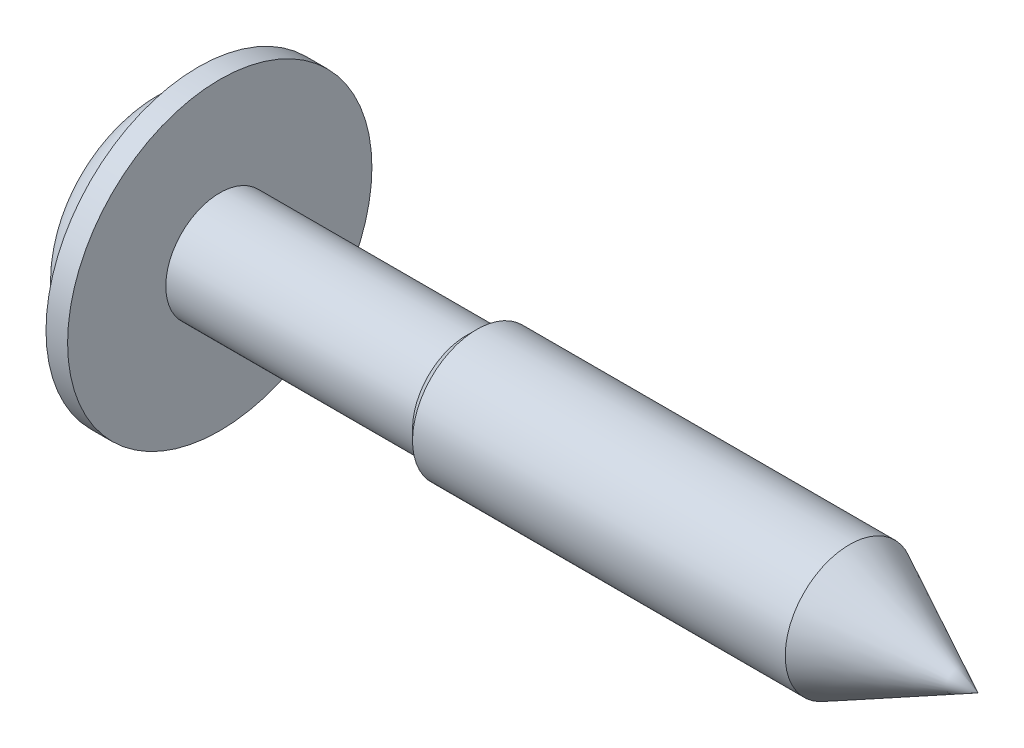
ISO-10303-21;
HEADER;
FILE_DESCRIPTION(('STEP AP214'),'2;1');
FILE_NAME('part.step','',(''),(''),'','','');
FILE_SCHEMA(('AUTOMOTIVE_DESIGN { 1 0 10303 214 1 1 1 1 }'));
ENDSEC;
DATA;
#1=APPLICATION_CONTEXT('core data for automotive mechanical design processes');
#2=APPLICATION_PROTOCOL_DEFINITION('international standard','automotive_design',2000,#1);
#3=PRODUCT_CONTEXT('',#1,'mechanical');
#4=PRODUCT('Part','Part','',(#3));
#5=PRODUCT_RELATED_PRODUCT_CATEGORY('part','',(#4));
#6=PRODUCT_DEFINITION_FORMATION('','',#4);
#7=PRODUCT_DEFINITION_CONTEXT('part definition',#1,'design');
#8=PRODUCT_DEFINITION('design','',#6,#7);
#9=PRODUCT_DEFINITION_SHAPE('','',#8);
#10=(LENGTH_UNIT() NAMED_UNIT(*) SI_UNIT(.MILLI.,.METRE.));
#11=(NAMED_UNIT(*) PLANE_ANGLE_UNIT() SI_UNIT($,.RADIAN.));
#12=(NAMED_UNIT(*) SI_UNIT($,.STERADIAN.) SOLID_ANGLE_UNIT());
#13=UNCERTAINTY_MEASURE_WITH_UNIT(LENGTH_MEASURE(1.E-05),#10,'distance_accuracy_value','');
#14=(GEOMETRIC_REPRESENTATION_CONTEXT(3) GLOBAL_UNCERTAINTY_ASSIGNED_CONTEXT((#13)) GLOBAL_UNIT_ASSIGNED_CONTEXT((#10,
#11,#12)) REPRESENTATION_CONTEXT('',''));
#15=CARTESIAN_POINT('',(0.,0.,0.));
#16=DIRECTION('',(0.,0.,1.));
#17=DIRECTION('',(1.,0.,0.));
#18=AXIS2_PLACEMENT_3D('',#15,#16,#17);
#19=CARTESIAN_POINT('',(12.25,0.,0.));
#20=DIRECTION('',(-1.,0.,0.));
#21=DIRECTION('',(0.,1.,0.));
#22=AXIS2_PLACEMENT_3D('',#19,#20,#21);
#23=CONICAL_SURFACE('',#22,1.25,0.463647609000806);
#24=DIRECTION('',(-0.894427190999916,-0.447213595499958,0.));
#25=VECTOR('',#24,1.);
#26=CARTESIAN_POINT('',(12.25,-1.25,0.));
#27=LINE('',#26,#25);
#28=CARTESIAN_POINT('',(14.75,0.,0.));
#29=VERTEX_POINT('',#28);
#30=CARTESIAN_POINT('',(12.25,-1.25,0.));
#31=VERTEX_POINT('',#30);
#32=EDGE_CURVE('E13',#29,#31,#27,.T.);
#33=ORIENTED_EDGE('',*,*,#32,.T.);
#34=CARTESIAN_POINT('',(12.25,0.,0.));
#35=DIRECTION('',(1.,0.,0.));
#36=DIRECTION('',(0.,0.,-1.));
#37=AXIS2_PLACEMENT_3D('',#34,#35,#36);
#38=CIRCLE('',#37,1.25);
#39=EDGE_CURVE('E217',#31,#31,#38,.T.);
#40=ORIENTED_EDGE('',*,*,#39,.T.);
#41=ORIENTED_EDGE('',*,*,#32,.F.);
#42=EDGE_LOOP('',(#33,#40,#41));
#43=FACE_BOUND('',#42,.T.);
#44=ADVANCED_FACE('F24',(#43),#23,.T.);
#45=CARTESIAN_POINT('',(8.625,0.,0.));
#46=DIRECTION('',(1.,0.,0.));
#47=DIRECTION('',(0.,1.,0.));
#48=AXIS2_PLACEMENT_3D('',#45,#46,#47);
#49=CYLINDRICAL_SURFACE('',#48,1.25);
#50=ORIENTED_EDGE('',*,*,#39,.F.);
#51=DIRECTION('',(-1.,0.,0.));
#52=VECTOR('',#51,1.);
#53=CARTESIAN_POINT('',(8.625,-1.25,0.));
#54=LINE('',#53,#52);
#55=CARTESIAN_POINT('',(5.,-1.25,0.));
#56=VERTEX_POINT('',#55);
#57=EDGE_CURVE('E35',#31,#56,#54,.T.);
#58=ORIENTED_EDGE('',*,*,#57,.T.);
#59=CARTESIAN_POINT('',(5.,0.,0.));
#60=DIRECTION('',(1.,0.,0.));
#61=DIRECTION('',(0.,0.,-1.));
#62=AXIS2_PLACEMENT_3D('',#59,#60,#61);
#63=CIRCLE('',#62,1.25);
#64=EDGE_CURVE('E28',#56,#56,#63,.T.);
#65=ORIENTED_EDGE('',*,*,#64,.T.);
#66=ORIENTED_EDGE('',*,*,#57,.F.);
#67=EDGE_LOOP('',(#50,#58,#65,#66));
#68=FACE_BOUND('',#67,.T.);
#69=ADVANCED_FACE('F432',(#68),#49,.T.);
#70=CARTESIAN_POINT('',(4.9,0.,0.));
#71=DIRECTION('',(1.,0.,0.));
#72=DIRECTION('',(0.,1.,0.));
#73=AXIS2_PLACEMENT_3D('',#70,#71,#72);
#74=CONICAL_SURFACE('',#73,1.15,0.78539816339745);
#75=ORIENTED_EDGE('',*,*,#64,.F.);
#76=DIRECTION('',(-0.707106781186547,0.707106781186549,0.));
#77=VECTOR('',#76,1.);
#78=CARTESIAN_POINT('',(4.9,-1.15,0.));
#79=LINE('',#78,#77);
#80=CARTESIAN_POINT('',(4.8,-1.05,0.));
#81=VERTEX_POINT('',#80);
#82=EDGE_CURVE('E220',#56,#81,#79,.T.);
#83=ORIENTED_EDGE('',*,*,#82,.T.);
#84=CARTESIAN_POINT('',(4.8,0.,0.));
#85=DIRECTION('',(1.,0.,0.));
#86=DIRECTION('',(0.,0.,-1.));
#87=AXIS2_PLACEMENT_3D('',#84,#85,#86);
#88=CIRCLE('',#87,1.05);
#89=EDGE_CURVE('E216',#81,#81,#88,.T.);
#90=ORIENTED_EDGE('',*,*,#89,.T.);
#91=ORIENTED_EDGE('',*,*,#82,.F.);
#92=EDGE_LOOP('',(#75,#83,#90,#91));
#93=FACE_BOUND('',#92,.T.);
#94=ADVANCED_FACE('F426',(#93),#74,.T.);
#95=CARTESIAN_POINT('',(2.4,0.,0.));
#96=DIRECTION('',(1.,0.,0.));
#97=DIRECTION('',(0.,1.,0.));
#98=AXIS2_PLACEMENT_3D('',#95,#96,#97);
#99=CYLINDRICAL_SURFACE('',#98,1.05);
#100=ORIENTED_EDGE('',*,*,#89,.F.);
#101=DIRECTION('',(-1.,0.,0.));
#102=VECTOR('',#101,1.);
#103=CARTESIAN_POINT('',(2.4,-1.05,0.));
#104=LINE('',#103,#102);
#105=CARTESIAN_POINT('',(0.,-1.05,0.));
#106=VERTEX_POINT('',#105);
#107=EDGE_CURVE('E257',#81,#106,#104,.T.);
#108=ORIENTED_EDGE('',*,*,#107,.T.);
#109=CARTESIAN_POINT('',(0.,0.,0.));
#110=DIRECTION('',(1.,0.,0.));
#111=DIRECTION('',(0.,0.,-1.));
#112=AXIS2_PLACEMENT_3D('',#109,#110,#111);
#113=CIRCLE('',#112,1.05);
#114=EDGE_CURVE('E212',#106,#106,#113,.T.);
#115=ORIENTED_EDGE('',*,*,#114,.T.);
#116=ORIENTED_EDGE('',*,*,#107,.F.);
#117=EDGE_LOOP('',(#100,#108,#115,#116));
#118=FACE_BOUND('',#117,.T.);
#119=ADVANCED_FACE('F431',(#118),#99,.T.);
#120=CARTESIAN_POINT('',(0.,1.05,0.));
#121=DIRECTION('',(1.,0.,0.));
#122=DIRECTION('',(0.,1.,0.));
#123=AXIS2_PLACEMENT_3D('',#120,#121,#122);
#124=PLANE('',#123);
#125=ORIENTED_EDGE('',*,*,#114,.F.);
#126=EDGE_LOOP('',(#125));
#127=FACE_BOUND('',#126,.T.);
#128=CARTESIAN_POINT('',(0.,0.,0.));
#129=DIRECTION('',(1.,0.,0.));
#130=DIRECTION('',(0.,0.,-1.));
#131=AXIS2_PLACEMENT_3D('',#128,#129,#130);
#132=CIRCLE('',#131,2.96);
#133=CARTESIAN_POINT('',(0.,-2.96,0.));
#134=VERTEX_POINT('',#133);
#135=EDGE_CURVE('E201',#134,#134,#132,.T.);
#136=ORIENTED_EDGE('',*,*,#135,.T.);
#137=EDGE_LOOP('',(#136));
#138=FACE_BOUND('',#137,.T.);
#139=ADVANCED_FACE('F473',(#127,#138),#124,.T.);
#140=CARTESIAN_POINT('',(-0.21,0.,0.));
#141=DIRECTION('',(1.,0.,0.));
#142=DIRECTION('',(0.,1.,0.));
#143=AXIS2_PLACEMENT_3D('',#140,#141,#142);
#144=CYLINDRICAL_SURFACE('',#143,2.96);
#145=ORIENTED_EDGE('',*,*,#135,.F.);
#146=DIRECTION('',(-1.,0.,0.));
#147=VECTOR('',#146,1.);
#148=CARTESIAN_POINT('',(-0.21,-2.96,0.));
#149=LINE('',#148,#147);
#150=CARTESIAN_POINT('',(-0.42,-2.96,0.));
#151=VERTEX_POINT('',#150);
#152=EDGE_CURVE('E205',#134,#151,#149,.T.);
#153=ORIENTED_EDGE('',*,*,#152,.T.);
#154=CARTESIAN_POINT('',(-0.42,0.,0.));
#155=DIRECTION('',(1.,0.,0.));
#156=DIRECTION('',(0.,0.,-1.));
#157=AXIS2_PLACEMENT_3D('',#154,#155,#156);
#158=CIRCLE('',#157,2.96);
#159=EDGE_CURVE('E206',#151,#151,#158,.T.);
#160=ORIENTED_EDGE('',*,*,#159,.T.);
#161=ORIENTED_EDGE('',*,*,#152,.F.);
#162=EDGE_LOOP('',(#145,#153,#160,#161));
#163=FACE_BOUND('',#162,.T.);
#164=ADVANCED_FACE('F490',(#163),#144,.T.);
#165=CARTESIAN_POINT('',(-0.42,2.96,0.));
#166=DIRECTION('',(-1.,0.,0.));
#167=DIRECTION('',(0.,0.,1.));
#168=AXIS2_PLACEMENT_3D('',#165,#166,#167);
#169=PLANE('',#168);
#170=CARTESIAN_POINT('',(-0.42,0.,0.));
#171=DIRECTION('',(1.,0.,0.));
#172=DIRECTION('',(0.,0.,-1.));
#173=AXIS2_PLACEMENT_3D('',#170,#171,#172);
#174=CIRCLE('',#173,2.3);
#175=CARTESIAN_POINT('',(-0.42,-2.3,0.));
#176=VERTEX_POINT('',#175);
#177=EDGE_CURVE('E262',#176,#176,#174,.T.);
#178=ORIENTED_EDGE('',*,*,#177,.T.);
#179=EDGE_LOOP('',(#178));
#180=FACE_BOUND('',#179,.T.);
#181=ORIENTED_EDGE('',*,*,#159,.F.);
#182=EDGE_LOOP('',(#181));
#183=FACE_BOUND('',#182,.T.);
#184=ADVANCED_FACE('F484',(#180,#183),#169,.T.);
#185=CARTESIAN_POINT('',(-0.550844372239627,0.,0.));
#186=DIRECTION('',(1.,0.,0.));
#187=DIRECTION('',(0.,1.,0.));
#188=AXIS2_PLACEMENT_3D('',#185,#186,#187);
#189=CYLINDRICAL_SURFACE('',#188,2.3);
#190=ORIENTED_EDGE('',*,*,#177,.F.);
#191=DIRECTION('',(-1.,0.,0.));
#192=VECTOR('',#191,1.);
#193=CARTESIAN_POINT('',(-0.550844372239627,-2.3,0.));
#194=LINE('',#193,#192);
#195=CARTESIAN_POINT('',(-0.681688744479256,-2.3,0.));
#196=VERTEX_POINT('',#195);
#197=EDGE_CURVE('E258',#176,#196,#194,.T.);
#198=ORIENTED_EDGE('',*,*,#197,.T.);
#199=CARTESIAN_POINT('',(-0.681688744479256,0.,0.));
#200=DIRECTION('',(1.,0.,0.));
#201=DIRECTION('',(0.,0.,-1.));
#202=AXIS2_PLACEMENT_3D('',#199,#200,#201);
#203=CIRCLE('',#202,2.3);
#204=CARTESIAN_POINT('',(-0.681688744479256,0.,2.3));
#205=VERTEX_POINT('',#204);
#206=EDGE_CURVE('E245',#196,#205,#203,.T.);
#207=ORIENTED_EDGE('',*,*,#206,.T.);
#208=CARTESIAN_POINT('',(-0.681688744479256,0.,0.));
#209=DIRECTION('',(1.,0.,0.));
#210=DIRECTION('',(0.,0.,-1.));
#211=AXIS2_PLACEMENT_3D('',#208,#209,#210);
#212=CIRCLE('',#211,2.3);
#213=EDGE_CURVE('E272',#205,#196,#212,.T.);
#214=ORIENTED_EDGE('',*,*,#213,.T.);
#215=ORIENTED_EDGE('',*,*,#197,.F.);
#216=EDGE_LOOP('',(#190,#198,#207,#214,#215));
#217=FACE_BOUND('',#216,.T.);
#218=ADVANCED_FACE('F479',(#217),#189,.T.);
#219=CARTESIAN_POINT('',(-0.681688744479256,0.,0.));
#220=DIRECTION('',(1.,0.,0.));
#221=DIRECTION('',(0.,0.,-1.));
#222=AXIS2_PLACEMENT_3D('',#219,#220,#221);
#223=TOROIDAL_SURFACE('',#222,1.55,0.75);
#224=ORIENTED_EDGE('',*,*,#206,.F.);
#225=ORIENTED_EDGE('',*,*,#213,.F.);
#226=CARTESIAN_POINT('',(-0.681688744479256,0.,1.55));
#227=DIRECTION('',(0.,-1.,0.));
#228=DIRECTION('',(0.,0.,1.));
#229=AXIS2_PLACEMENT_3D('',#226,#227,#228);
#230=CIRCLE('',#229,0.75);
#231=CARTESIAN_POINT('',(-1.423,0.,1.66383155291153));
#232=VERTEX_POINT('',#231);
#233=EDGE_CURVE('E276',#205,#232,#230,.T.);
#234=ORIENTED_EDGE('',*,*,#233,.T.);
#235=CARTESIAN_POINT('',(-1.423,0.,0.));
#236=DIRECTION('',(1.,0.,0.));
#237=DIRECTION('',(0.,0.,-1.));
#238=AXIS2_PLACEMENT_3D('',#235,#236,#237);
#239=CIRCLE('',#238,1.66383155291153);
#240=EDGE_CURVE('E241',#232,#232,#239,.T.);
#241=ORIENTED_EDGE('',*,*,#240,.T.);
#242=ORIENTED_EDGE('',*,*,#233,.F.);
#243=EDGE_LOOP('',(#224,#225,#234,#241,#242));
#244=FACE_BOUND('',#243,.T.);
#245=ADVANCED_FACE('F453',(#244),#223,.T.);
#246=CARTESIAN_POINT('',(9.41245841127586,0.,0.));
#247=DIRECTION('',(0.,0.,1.));
#248=DIRECTION('',(-0.999984183657097,-0.00562427201065698,0.));
#249=AXIS2_PLACEMENT_3D('',#246,#247,#248);
#250=SPHERICAL_SURFACE('',#249,10.9624584112759);
#251=CARTESIAN_POINT('',(9.41245841127586,0.,0.325));
#252=DIRECTION('',(0.,0.,1.));
#253=DIRECTION('',(0.,1.,0.));
#254=AXIS2_PLACEMENT_3D('',#251,#252,#253);
#255=CIRCLE('',#254,10.9576397741007);
#256=CARTESIAN_POINT('',(-1.4399511154896,1.5149511154896,0.325));
#257=VERTEX_POINT('',#256);
#258=CARTESIAN_POINT('',(-1.54036060571483,0.325,0.325));
#259=VERTEX_POINT('',#258);
#260=EDGE_CURVE('E246',#257,#259,#255,.T.);
#261=ORIENTED_EDGE('',*,*,#260,.T.);
#262=CARTESIAN_POINT('',(9.41245841127586,0.325,0.));
#263=DIRECTION('',(0.,1.,0.));
#264=DIRECTION('',(0.,0.,-1.));
#265=AXIS2_PLACEMENT_3D('',#262,#263,#264);
#266=CIRCLE('',#265,10.9576397741007);
#267=CARTESIAN_POINT('',(-1.4399511154896,0.325,1.5149511154896));
#268=VERTEX_POINT('',#267);
#269=EDGE_CURVE('E169',#259,#268,#266,.T.);
#270=ORIENTED_EDGE('',*,*,#269,.T.);
#271=CARTESIAN_POINT('',(4.74372920563793,0.,-4.66872920563793));
#272=DIRECTION('',(0.707106781186547,0.,0.707106781186548));
#273=DIRECTION('',(0.,1.,0.));
#274=AXIS2_PLACEMENT_3D('',#271,#272,#273);
#275=CIRCLE('',#274,8.75108162616483);
#276=CARTESIAN_POINT('',(-1.4399511154896,-0.325,1.5149511154896));
#277=VERTEX_POINT('',#276);
#278=EDGE_CURVE('E159',#268,#277,#275,.T.);
#279=ORIENTED_EDGE('',*,*,#278,.T.);
#280=CARTESIAN_POINT('',(9.41245841127586,-0.325,0.));
#281=DIRECTION('',(0.,-1.,0.));
#282=DIRECTION('',(0.,0.,1.));
#283=AXIS2_PLACEMENT_3D('',#280,#281,#282);
#284=CIRCLE('',#283,10.9576397741007);
#285=CARTESIAN_POINT('',(-1.54036060571483,-0.325,0.325));
#286=VERTEX_POINT('',#285);
#287=EDGE_CURVE('E143',#277,#286,#284,.T.);
#288=ORIENTED_EDGE('',*,*,#287,.T.);
#289=CARTESIAN_POINT('',(9.41245841127586,0.,0.325));
#290=DIRECTION('',(0.,0.,1.));
#291=DIRECTION('',(0.,1.,0.));
#292=AXIS2_PLACEMENT_3D('',#289,#290,#291);
#293=CIRCLE('',#292,10.9576397741007);
#294=CARTESIAN_POINT('',(-1.4399511154896,-1.5149511154896,0.325));
#295=VERTEX_POINT('',#294);
#296=EDGE_CURVE('E184',#286,#295,#293,.T.);
#297=ORIENTED_EDGE('',*,*,#296,.T.);
#298=CARTESIAN_POINT('',(4.74372920563793,4.66872920563793,0.));
#299=DIRECTION('',(0.707106781186547,-0.707106781186548,0.));
#300=DIRECTION('',(0.,0.,1.));
#301=AXIS2_PLACEMENT_3D('',#298,#299,#300);
#302=CIRCLE('',#301,8.75108162616483);
#303=CARTESIAN_POINT('',(-1.4399511154896,-1.5149511154896,-0.325));
#304=VERTEX_POINT('',#303);
#305=EDGE_CURVE('E297',#295,#304,#302,.T.);
#306=ORIENTED_EDGE('',*,*,#305,.T.);
#307=CARTESIAN_POINT('',(9.41245841127586,0.,-0.325));
#308=DIRECTION('',(0.,0.,-1.));
#309=DIRECTION('',(0.,-1.,0.));
#310=AXIS2_PLACEMENT_3D('',#307,#308,#309);
#311=CIRCLE('',#310,10.9576397741007);
#312=CARTESIAN_POINT('',(-1.54036060571483,-0.325,-0.325));
#313=VERTEX_POINT('',#312);
#314=EDGE_CURVE('E207',#304,#313,#311,.T.);
#315=ORIENTED_EDGE('',*,*,#314,.T.);
#316=CARTESIAN_POINT('',(9.41245841127586,-0.325,0.));
#317=DIRECTION('',(0.,-1.,0.));
#318=DIRECTION('',(0.,0.,1.));
#319=AXIS2_PLACEMENT_3D('',#316,#317,#318);
#320=CIRCLE('',#319,10.9576397741007);
#321=CARTESIAN_POINT('',(-1.4399511154896,-0.325,-1.5149511154896));
#322=VERTEX_POINT('',#321);
#323=EDGE_CURVE('E172',#313,#322,#320,.T.);
#324=ORIENTED_EDGE('',*,*,#323,.T.);
#325=CARTESIAN_POINT('',(4.74372920563793,0.,4.66872920563793));
#326=DIRECTION('',(0.707106781186547,0.,-0.707106781186548));
#327=DIRECTION('',(0.,-1.,0.));
#328=AXIS2_PLACEMENT_3D('',#325,#326,#327);
#329=CIRCLE('',#328,8.75108162616483);
#330=CARTESIAN_POINT('',(-1.4399511154896,0.325,-1.5149511154896));
#331=VERTEX_POINT('',#330);
#332=EDGE_CURVE('E135',#322,#331,#329,.T.);
#333=ORIENTED_EDGE('',*,*,#332,.T.);
#334=CARTESIAN_POINT('',(9.41245841127586,0.325,0.));
#335=DIRECTION('',(0.,1.,0.));
#336=DIRECTION('',(0.,0.,-1.));
#337=AXIS2_PLACEMENT_3D('',#334,#335,#336);
#338=CIRCLE('',#337,10.9576397741007);
#339=CARTESIAN_POINT('',(-1.54036060571483,0.325,-0.325));
#340=VERTEX_POINT('',#339);
#341=EDGE_CURVE('E226',#331,#340,#338,.T.);
#342=ORIENTED_EDGE('',*,*,#341,.T.);
#343=CARTESIAN_POINT('',(9.41245841127586,0.,-0.325));
#344=DIRECTION('',(0.,0.,-1.));
#345=DIRECTION('',(0.,-1.,0.));
#346=AXIS2_PLACEMENT_3D('',#343,#344,#345);
#347=CIRCLE('',#346,10.9576397741007);
#348=CARTESIAN_POINT('',(-1.4399511154896,1.5149511154896,-0.325));
#349=VERTEX_POINT('',#348);
#350=EDGE_CURVE('E186',#340,#349,#347,.T.);
#351=ORIENTED_EDGE('',*,*,#350,.T.);
#352=CARTESIAN_POINT('',(4.74372920563793,-4.66872920563793,0.));
#353=DIRECTION('',(0.707106781186547,0.707106781186548,0.));
#354=DIRECTION('',(0.,0.,-1.));
#355=AXIS2_PLACEMENT_3D('',#352,#353,#354);
#356=CIRCLE('',#355,8.75108162616483);
#357=EDGE_CURVE('E225',#349,#257,#356,.T.);
#358=ORIENTED_EDGE('',*,*,#357,.T.);
#359=EDGE_LOOP('',(#261,#270,#279,#288,#297,#306,#315,#324,#333,#342,#351,#358));
#360=FACE_BOUND('',#359,.T.);
#361=ORIENTED_EDGE('',*,*,#240,.F.);
#362=EDGE_LOOP('',(#361));
#363=FACE_BOUND('',#362,.T.);
#364=ADVANCED_FACE('F166',(#360,#363),#250,.T.);
#365=CARTESIAN_POINT('',(-0.25,0.,0.325));
#366=DIRECTION('',(1.,0.,0.));
#367=DIRECTION('',(0.,1.,0.));
#368=AXIS2_PLACEMENT_3D('',#365,#366,#367);
#369=PLANE('',#368);
#370=DIRECTION('',(0.,1.,0.));
#371=VECTOR('',#370,1.);
#372=CARTESIAN_POINT('',(-0.25,0.,-0.325));
#373=LINE('',#372,#371);
#374=CARTESIAN_POINT('',(-0.25,-0.325,-0.325));
#375=VERTEX_POINT('',#374);
#376=CARTESIAN_POINT('',(-0.25,0.325,-0.325));
#377=VERTEX_POINT('',#376);
#378=EDGE_CURVE('E200',#375,#377,#373,.T.);
#379=ORIENTED_EDGE('',*,*,#378,.F.);
#380=DIRECTION('',(0.,0.,1.));
#381=VECTOR('',#380,1.);
#382=CARTESIAN_POINT('',(-0.25,-0.325,0.325));
#383=LINE('',#382,#381);
#384=CARTESIAN_POINT('',(-0.25,-0.325,0.325));
#385=VERTEX_POINT('',#384);
#386=EDGE_CURVE('E266',#375,#385,#383,.T.);
#387=ORIENTED_EDGE('',*,*,#386,.T.);
#388=DIRECTION('',(0.,-1.,0.));
#389=VECTOR('',#388,1.);
#390=CARTESIAN_POINT('',(-0.25,0.,0.325));
#391=LINE('',#390,#389);
#392=CARTESIAN_POINT('',(-0.25,0.325,0.325));
#393=VERTEX_POINT('',#392);
#394=EDGE_CURVE('E161',#393,#385,#391,.T.);
#395=ORIENTED_EDGE('',*,*,#394,.F.);
#396=DIRECTION('',(0.,0.,-1.));
#397=VECTOR('',#396,1.);
#398=CARTESIAN_POINT('',(-0.25,0.325,0.325));
#399=LINE('',#398,#397);
#400=EDGE_CURVE('E228',#393,#377,#399,.T.);
#401=ORIENTED_EDGE('',*,*,#400,.T.);
#402=EDGE_LOOP('',(#379,#387,#395,#401));
#403=FACE_BOUND('',#402,.T.);
#404=ADVANCED_FACE('F26',(#403),#369,.F.);
#405=CARTESIAN_POINT('',(-0.25,0.,-0.325));
#406=DIRECTION('',(0.707106781186547,0.,-0.707106781186548));
#407=DIRECTION('',(0.,-1.,0.));
#408=AXIS2_PLACEMENT_3D('',#405,#406,#407);
#409=PLANE('',#408);
#410=ORIENTED_EDGE('',*,*,#332,.F.);
#411=DIRECTION('',(0.707106781186548,0.,0.707106781186547));
#412=VECTOR('',#411,1.);
#413=CARTESIAN_POINT('',(-0.25,-0.325,-0.325));
#414=LINE('',#413,#412);
#415=EDGE_CURVE('E180',#322,#375,#414,.T.);
#416=ORIENTED_EDGE('',*,*,#415,.T.);
#417=ORIENTED_EDGE('',*,*,#378,.T.);
#418=DIRECTION('',(-0.707106781186548,0.,-0.707106781186547));
#419=VECTOR('',#418,1.);
#420=CARTESIAN_POINT('',(-0.25,0.325,-0.325));
#421=LINE('',#420,#419);
#422=EDGE_CURVE('E197',#377,#331,#421,.T.);
#423=ORIENTED_EDGE('',*,*,#422,.T.);
#424=EDGE_LOOP('',(#410,#416,#417,#423));
#425=FACE_BOUND('',#424,.T.);
#426=ADVANCED_FACE('F545',(#425),#409,.F.);
#427=CARTESIAN_POINT('',(-1.,-0.325,0.));
#428=DIRECTION('',(0.,-1.,0.));
#429=DIRECTION('',(0.,0.,-1.));
#430=AXIS2_PLACEMENT_3D('',#427,#428,#429);
#431=PLANE('',#430);
#432=DIRECTION('',(-1.,0.,0.));
#433=VECTOR('',#432,1.);
#434=CARTESIAN_POINT('',(-1.,-0.325,0.325));
#435=LINE('',#434,#433);
#436=EDGE_CURVE('E149',#385,#286,#435,.T.);
#437=ORIENTED_EDGE('',*,*,#436,.T.);
#438=ORIENTED_EDGE('',*,*,#287,.F.);
#439=DIRECTION('',(-0.707106781186548,0.,0.707106781186547));
#440=VECTOR('',#439,1.);
#441=CARTESIAN_POINT('',(-1.75,-0.325,1.825));
#442=LINE('',#441,#440);
#443=EDGE_CURVE('E146',#385,#277,#442,.T.);
#444=ORIENTED_EDGE('',*,*,#443,.F.);
#445=EDGE_LOOP('',(#437,#438,#444));
#446=FACE_BOUND('',#445,.T.);
#447=ADVANCED_FACE('F145',(#446),#431,.F.);
#448=CARTESIAN_POINT('',(-1.75,0.,1.825));
#449=DIRECTION('',(0.707106781186547,0.,0.707106781186548));
#450=DIRECTION('',(0.,-1.,0.));
#451=AXIS2_PLACEMENT_3D('',#448,#449,#450);
#452=PLANE('',#451);
#453=ORIENTED_EDGE('',*,*,#278,.F.);
#454=DIRECTION('',(0.707106781186548,0.,-0.707106781186547));
#455=VECTOR('',#454,1.);
#456=CARTESIAN_POINT('',(-1.75,0.325,1.825));
#457=LINE('',#456,#455);
#458=EDGE_CURVE('E194',#268,#393,#457,.T.);
#459=ORIENTED_EDGE('',*,*,#458,.T.);
#460=ORIENTED_EDGE('',*,*,#394,.T.);
#461=ORIENTED_EDGE('',*,*,#443,.T.);
#462=EDGE_LOOP('',(#453,#459,#460,#461));
#463=FACE_BOUND('',#462,.T.);
#464=ADVANCED_FACE('F157',(#463),#452,.F.);
#465=CARTESIAN_POINT('',(-1.,-0.325,0.));
#466=DIRECTION('',(0.,-1.,0.));
#467=DIRECTION('',(0.,0.,-1.));
#468=AXIS2_PLACEMENT_3D('',#465,#466,#467);
#469=PLANE('',#468);
#470=DIRECTION('',(1.,0.,0.));
#471=VECTOR('',#470,1.);
#472=CARTESIAN_POINT('',(-1.,-0.325,-0.325));
#473=LINE('',#472,#471);
#474=EDGE_CURVE('E191',#313,#375,#473,.T.);
#475=ORIENTED_EDGE('',*,*,#474,.T.);
#476=ORIENTED_EDGE('',*,*,#415,.F.);
#477=ORIENTED_EDGE('',*,*,#323,.F.);
#478=EDGE_LOOP('',(#475,#476,#477));
#479=FACE_BOUND('',#478,.T.);
#480=ADVANCED_FACE('F443',(#479),#469,.F.);
#481=CARTESIAN_POINT('',(-1.,0.325,0.));
#482=DIRECTION('',(0.,1.,0.));
#483=DIRECTION('',(1.,0.,0.));
#484=AXIS2_PLACEMENT_3D('',#481,#482,#483);
#485=PLANE('',#484);
#486=DIRECTION('',(1.,0.,0.));
#487=VECTOR('',#486,1.);
#488=CARTESIAN_POINT('',(-1.,0.325,0.325));
#489=LINE('',#488,#487);
#490=EDGE_CURVE('E253',#259,#393,#489,.T.);
#491=ORIENTED_EDGE('',*,*,#490,.T.);
#492=ORIENTED_EDGE('',*,*,#458,.F.);
#493=ORIENTED_EDGE('',*,*,#269,.F.);
#494=EDGE_LOOP('',(#491,#492,#493));
#495=FACE_BOUND('',#494,.T.);
#496=ADVANCED_FACE('F509',(#495),#485,.F.);
#497=CARTESIAN_POINT('',(-1.,0.325,0.));
#498=DIRECTION('',(0.,1.,0.));
#499=DIRECTION('',(1.,0.,0.));
#500=AXIS2_PLACEMENT_3D('',#497,#498,#499);
#501=PLANE('',#500);
#502=DIRECTION('',(-1.,0.,0.));
#503=VECTOR('',#502,1.);
#504=CARTESIAN_POINT('',(-1.,0.325,-0.325));
#505=LINE('',#504,#503);
#506=EDGE_CURVE('E190',#377,#340,#505,.T.);
#507=ORIENTED_EDGE('',*,*,#506,.T.);
#508=ORIENTED_EDGE('',*,*,#341,.F.);
#509=ORIENTED_EDGE('',*,*,#422,.F.);
#510=EDGE_LOOP('',(#507,#508,#509));
#511=FACE_BOUND('',#510,.T.);
#512=ADVANCED_FACE('F419',(#511),#501,.F.);
#513=CARTESIAN_POINT('',(-0.25,0.325,0.));
#514=DIRECTION('',(0.707106781186547,0.707106781186548,0.));
#515=DIRECTION('',(0.,0.,-1.));
#516=AXIS2_PLACEMENT_3D('',#513,#514,#515);
#517=PLANE('',#516);
#518=ORIENTED_EDGE('',*,*,#357,.F.);
#519=DIRECTION('',(0.707106781186548,-0.707106781186547,0.));
#520=VECTOR('',#519,1.);
#521=CARTESIAN_POINT('',(-0.25,0.325,-0.325));
#522=LINE('',#521,#520);
#523=EDGE_CURVE('E221',#349,#377,#522,.T.);
#524=ORIENTED_EDGE('',*,*,#523,.T.);
#525=ORIENTED_EDGE('',*,*,#400,.F.);
#526=DIRECTION('',(-0.707106781186548,0.707106781186547,0.));
#527=VECTOR('',#526,1.);
#528=CARTESIAN_POINT('',(-0.25,0.325,0.325));
#529=LINE('',#528,#527);
#530=EDGE_CURVE('E249',#393,#257,#529,.T.);
#531=ORIENTED_EDGE('',*,*,#530,.T.);
#532=EDGE_LOOP('',(#518,#524,#525,#531));
#533=FACE_BOUND('',#532,.T.);
#534=ADVANCED_FACE('F413',(#533),#517,.F.);
#535=CARTESIAN_POINT('',(-1.,0.,-0.325));
#536=DIRECTION('',(0.,0.,-1.));
#537=DIRECTION('',(0.,-1.,0.));
#538=AXIS2_PLACEMENT_3D('',#535,#536,#537);
#539=PLANE('',#538);
#540=ORIENTED_EDGE('',*,*,#350,.F.);
#541=ORIENTED_EDGE('',*,*,#506,.F.);
#542=ORIENTED_EDGE('',*,*,#523,.F.);
#543=EDGE_LOOP('',(#540,#541,#542));
#544=FACE_BOUND('',#543,.T.);
#545=ADVANCED_FACE('F418',(#544),#539,.F.);
#546=CARTESIAN_POINT('',(-1.,0.,-0.325));
#547=DIRECTION('',(0.,0.,-1.));
#548=DIRECTION('',(0.,-1.,0.));
#549=AXIS2_PLACEMENT_3D('',#546,#547,#548);
#550=PLANE('',#549);
#551=ORIENTED_EDGE('',*,*,#314,.F.);
#552=DIRECTION('',(-0.707106781186548,-0.707106781186547,0.));
#553=VECTOR('',#552,1.);
#554=CARTESIAN_POINT('',(-1.75,-1.825,-0.325));
#555=LINE('',#554,#553);
#556=EDGE_CURVE('E211',#375,#304,#555,.T.);
#557=ORIENTED_EDGE('',*,*,#556,.F.);
#558=ORIENTED_EDGE('',*,*,#474,.F.);
#559=EDGE_LOOP('',(#551,#557,#558));
#560=FACE_BOUND('',#559,.T.);
#561=ADVANCED_FACE('F464',(#560),#550,.F.);
#562=CARTESIAN_POINT('',(-1.75,-1.825,0.));
#563=DIRECTION('',(0.707106781186547,-0.707106781186548,0.));
#564=DIRECTION('',(0.,0.,-1.));
#565=AXIS2_PLACEMENT_3D('',#562,#563,#564);
#566=PLANE('',#565);
#567=ORIENTED_EDGE('',*,*,#305,.F.);
#568=DIRECTION('',(0.707106781186548,0.707106781186547,0.));
#569=VECTOR('',#568,1.);
#570=CARTESIAN_POINT('',(-1.75,-1.825,0.325));
#571=LINE('',#570,#569);
#572=EDGE_CURVE('E240',#295,#385,#571,.T.);
#573=ORIENTED_EDGE('',*,*,#572,.T.);
#574=ORIENTED_EDGE('',*,*,#386,.F.);
#575=ORIENTED_EDGE('',*,*,#556,.T.);
#576=EDGE_LOOP('',(#567,#573,#574,#575));
#577=FACE_BOUND('',#576,.T.);
#578=ADVANCED_FACE('F319',(#577),#566,.F.);
#579=CARTESIAN_POINT('',(-1.,0.,0.325));
#580=DIRECTION('',(0.,0.,1.));
#581=DIRECTION('',(0.,-1.,0.));
#582=AXIS2_PLACEMENT_3D('',#579,#580,#581);
#583=PLANE('',#582);
#584=ORIENTED_EDGE('',*,*,#260,.F.);
#585=ORIENTED_EDGE('',*,*,#530,.F.);
#586=ORIENTED_EDGE('',*,*,#490,.F.);
#587=EDGE_LOOP('',(#584,#585,#586));
#588=FACE_BOUND('',#587,.T.);
#589=ADVANCED_FACE('F463',(#588),#583,.F.);
#590=CARTESIAN_POINT('',(-1.,0.,0.325));
#591=DIRECTION('',(0.,0.,1.));
#592=DIRECTION('',(0.,-1.,0.));
#593=AXIS2_PLACEMENT_3D('',#590,#591,#592);
#594=PLANE('',#593);
#595=ORIENTED_EDGE('',*,*,#296,.F.);
#596=ORIENTED_EDGE('',*,*,#436,.F.);
#597=ORIENTED_EDGE('',*,*,#572,.F.);
#598=EDGE_LOOP('',(#595,#596,#597));
#599=FACE_BOUND('',#598,.T.);
#600=ADVANCED_FACE('F321',(#599),#594,.F.);
#601=CLOSED_SHELL('',(#44,#69,#94,#119,#139,#164,#184,#218,#245,#364,#404,#426,#447,#464,#480,
#496,#512,#534,#545,#561,#578,#589,#600));
#602=MANIFOLD_SOLID_BREP('B1',#601);
#603=ADVANCED_BREP_SHAPE_REPRESENTATION('',(#18,#602),#14);
#604=SHAPE_DEFINITION_REPRESENTATION(#9,#603);
ENDSEC;
END-ISO-10303-21;
